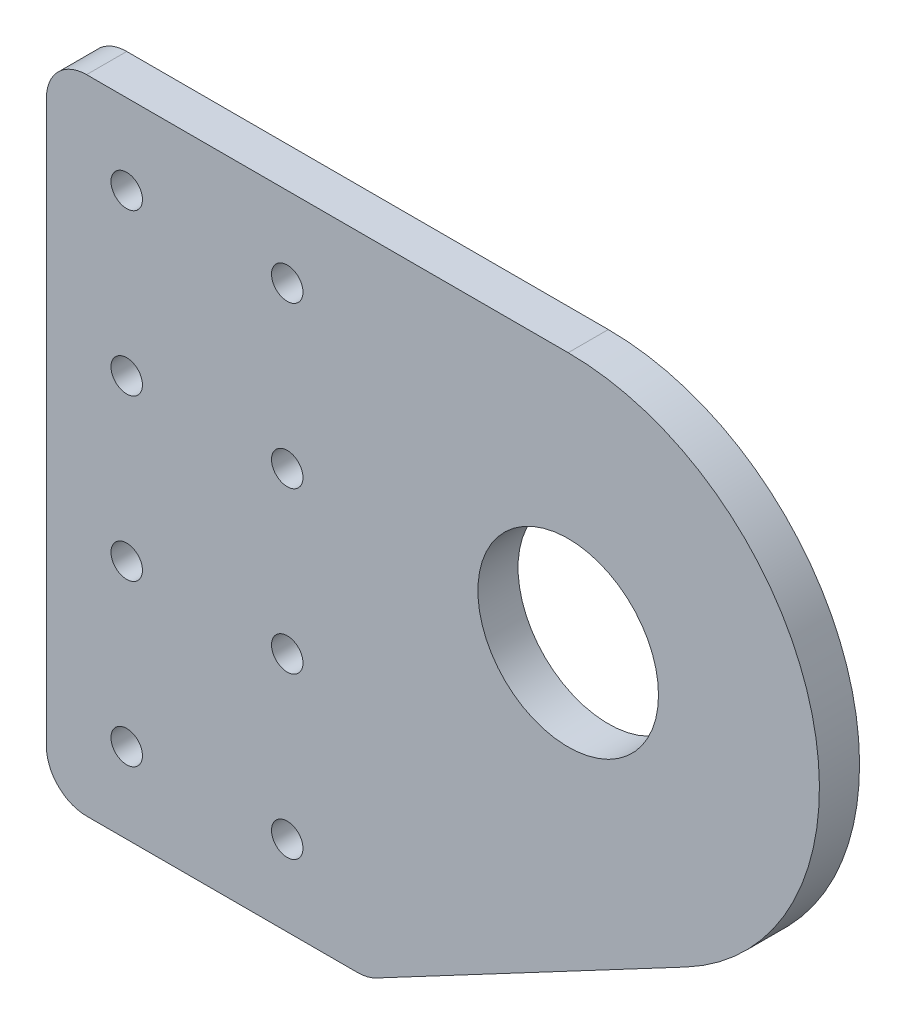
ISO-10303-21;
HEADER;
FILE_DESCRIPTION(('STEP AP214'),'2;1');
FILE_NAME('part.step','',(''),(''),'','','');
FILE_SCHEMA(('AUTOMOTIVE_DESIGN { 1 0 10303 214 1 1 1 1 }'));
ENDSEC;
DATA;
#1=APPLICATION_CONTEXT('core data for automotive mechanical design processes');
#2=APPLICATION_PROTOCOL_DEFINITION('international standard','automotive_design',2000,#1);
#3=PRODUCT_CONTEXT('',#1,'mechanical');
#4=PRODUCT('Part','Part','',(#3));
#5=PRODUCT_RELATED_PRODUCT_CATEGORY('part','',(#4));
#6=PRODUCT_DEFINITION_FORMATION('','',#4);
#7=PRODUCT_DEFINITION_CONTEXT('part definition',#1,'design');
#8=PRODUCT_DEFINITION('design','',#6,#7);
#9=PRODUCT_DEFINITION_SHAPE('','',#8);
#10=(LENGTH_UNIT() NAMED_UNIT(*) SI_UNIT(.MILLI.,.METRE.));
#11=(NAMED_UNIT(*) PLANE_ANGLE_UNIT() SI_UNIT($,.RADIAN.));
#12=(NAMED_UNIT(*) SI_UNIT($,.STERADIAN.) SOLID_ANGLE_UNIT());
#13=UNCERTAINTY_MEASURE_WITH_UNIT(LENGTH_MEASURE(1.E-05),#10,'distance_accuracy_value','');
#14=(GEOMETRIC_REPRESENTATION_CONTEXT(3) GLOBAL_UNCERTAINTY_ASSIGNED_CONTEXT((#13)) GLOBAL_UNIT_ASSIGNED_CONTEXT((#10,
#11,#12)) REPRESENTATION_CONTEXT('',''));
#15=CARTESIAN_POINT('',(0.,0.,0.));
#16=DIRECTION('',(0.,0.,1.));
#17=DIRECTION('',(1.,0.,0.));
#18=AXIS2_PLACEMENT_3D('',#15,#16,#17);
#19=CARTESIAN_POINT('',(482.6,471.551,6.35));
#20=DIRECTION('',(1.,0.,0.));
#21=DIRECTION('',(0.,0.,-1.));
#22=AXIS2_PLACEMENT_3D('',#19,#20,#21);
#23=PLANE('',#22);
#24=DIRECTION('',(0.,-1.,0.));
#25=VECTOR('',#24,1.);
#26=CARTESIAN_POINT('',(482.6,471.551,0.));
#27=LINE('',#26,#25);
#28=CARTESIAN_POINT('',(482.6,465.201,0.));
#29=VERTEX_POINT('',#28);
#30=CARTESIAN_POINT('',(482.6,376.301,0.));
#31=VERTEX_POINT('',#30);
#32=EDGE_CURVE('E138',#29,#31,#27,.T.);
#33=ORIENTED_EDGE('',*,*,#32,.T.);
#34=DIRECTION('',(0.,0.,-1.));
#35=VECTOR('',#34,1.);
#36=CARTESIAN_POINT('',(482.6,376.301,6.35));
#37=LINE('',#36,#35);
#38=CARTESIAN_POINT('',(482.6,376.301,6.35));
#39=VERTEX_POINT('',#38);
#40=EDGE_CURVE('E49',#31,#39,#37,.F.);
#41=ORIENTED_EDGE('',*,*,#40,.T.);
#42=DIRECTION('',(0.,-1.,0.));
#43=VECTOR('',#42,1.);
#44=CARTESIAN_POINT('',(482.6,471.551,6.35));
#45=LINE('',#44,#43);
#46=CARTESIAN_POINT('',(482.6,465.201,6.35));
#47=VERTEX_POINT('',#46);
#48=EDGE_CURVE('E149',#47,#39,#45,.T.);
#49=ORIENTED_EDGE('',*,*,#48,.F.);
#50=DIRECTION('',(0.,0.,-1.));
#51=VECTOR('',#50,1.);
#52=CARTESIAN_POINT('',(482.6,465.201,0.));
#53=LINE('',#52,#51);
#54=EDGE_CURVE('E168',#47,#29,#53,.T.);
#55=ORIENTED_EDGE('',*,*,#54,.T.);
#56=EDGE_LOOP('',(#33,#41,#49,#55));
#57=FACE_BOUND('',#56,.T.);
#58=ADVANCED_FACE('F41',(#57),#23,.F.);
#59=CARTESIAN_POINT('',(482.6,369.951,6.35));
#60=DIRECTION('',(0.,1.,0.));
#61=DIRECTION('',(0.,0.,1.));
#62=AXIS2_PLACEMENT_3D('',#59,#60,#61);
#63=PLANE('',#62);
#64=DIRECTION('',(1.,0.,0.));
#65=VECTOR('',#64,1.);
#66=CARTESIAN_POINT('',(482.6,369.951,0.));
#67=LINE('',#66,#65);
#68=CARTESIAN_POINT('',(488.95,369.951,0.));
#69=VERTEX_POINT('',#68);
#70=CARTESIAN_POINT('',(531.819562537797,369.951,0.));
#71=VERTEX_POINT('',#70);
#72=EDGE_CURVE('E140',#69,#71,#67,.T.);
#73=ORIENTED_EDGE('',*,*,#72,.T.);
#74=DIRECTION('',(0.,0.,-1.));
#75=VECTOR('',#74,1.);
#76=CARTESIAN_POINT('',(531.819562537797,369.951,6.35));
#77=LINE('',#76,#75);
#78=CARTESIAN_POINT('',(531.819562537797,369.951,6.35));
#79=VERTEX_POINT('',#78);
#80=EDGE_CURVE('E161',#71,#79,#77,.F.);
#81=ORIENTED_EDGE('',*,*,#80,.T.);
#82=DIRECTION('',(1.,0.,0.));
#83=VECTOR('',#82,1.);
#84=CARTESIAN_POINT('',(482.6,369.951,6.35));
#85=LINE('',#84,#83);
#86=CARTESIAN_POINT('',(488.95,369.951,6.35));
#87=VERTEX_POINT('',#86);
#88=EDGE_CURVE('E117',#87,#79,#85,.T.);
#89=ORIENTED_EDGE('',*,*,#88,.F.);
#90=DIRECTION('',(0.,0.,-1.));
#91=VECTOR('',#90,1.);
#92=CARTESIAN_POINT('',(488.95,369.951,6.35));
#93=LINE('',#92,#91);
#94=EDGE_CURVE('E158',#87,#69,#93,.T.);
#95=ORIENTED_EDGE('',*,*,#94,.T.);
#96=EDGE_LOOP('',(#73,#81,#89,#95));
#97=FACE_BOUND('',#96,.T.);
#98=ADVANCED_FACE('F183',(#97),#63,.F.);
#99=CARTESIAN_POINT('',(533.4,369.951,6.35));
#100=DIRECTION('',(-0.468739451596558,0.883336474123512,0.));
#101=DIRECTION('',(-0.883336474123512,-0.468739451596558,0.));
#102=AXIS2_PLACEMENT_3D('',#99,#100,#101);
#103=PLANE('',#102);
#104=DIRECTION('',(0.883336474123512,0.468739451596558,0.));
#105=VECTOR('',#104,1.);
#106=CARTESIAN_POINT('',(533.4,369.951,6.35));
#107=LINE('',#106,#105);
#108=CARTESIAN_POINT('',(534.796058055435,370.691813389316,6.35));
#109=VERTEX_POINT('',#108);
#110=CARTESIAN_POINT('',(583.782861940384,396.686491817242,6.35));
#111=VERTEX_POINT('',#110);
#112=EDGE_CURVE('E106',#109,#111,#107,.T.);
#113=ORIENTED_EDGE('',*,*,#112,.F.);
#114=DIRECTION('',(0.,0.,-1.));
#115=VECTOR('',#114,1.);
#116=CARTESIAN_POINT('',(534.796058055435,370.691813389316,6.35));
#117=LINE('',#116,#115);
#118=CARTESIAN_POINT('',(534.796058055435,370.691813389316,0.));
#119=VERTEX_POINT('',#118);
#120=EDGE_CURVE('E127',#109,#119,#117,.T.);
#121=ORIENTED_EDGE('',*,*,#120,.T.);
#122=DIRECTION('',(0.883336474123512,0.468739451596558,0.));
#123=VECTOR('',#122,1.);
#124=CARTESIAN_POINT('',(533.4,369.951,0.));
#125=LINE('',#124,#123);
#126=CARTESIAN_POINT('',(583.782861940384,396.686491817242,0.));
#127=VERTEX_POINT('',#126);
#128=EDGE_CURVE('E123',#119,#127,#125,.T.);
#129=ORIENTED_EDGE('',*,*,#128,.T.);
#130=DIRECTION('',(0.,0.,-1.));
#131=VECTOR('',#130,1.);
#132=CARTESIAN_POINT('',(583.782861940384,396.686491817242,6.35));
#133=LINE('',#132,#131);
#134=EDGE_CURVE('E120',#111,#127,#133,.T.);
#135=ORIENTED_EDGE('',*,*,#134,.F.);
#136=EDGE_LOOP('',(#113,#121,#129,#135));
#137=FACE_BOUND('',#136,.T.);
#138=ADVANCED_FACE('F121',(#137),#103,.F.);
#139=CARTESIAN_POINT('',(565.15,431.800000000067,6.35));
#140=DIRECTION('',(0.,0.,-1.));
#141=DIRECTION('',(-1.,0.,0.));
#142=AXIS2_PLACEMENT_3D('',#139,#140,#141);
#143=CYLINDRICAL_SURFACE('',#142,39.7509999999333);
#144=CARTESIAN_POINT('',(565.15,431.800000000067,0.));
#145=DIRECTION('',(0.,0.,-1.));
#146=DIRECTION('',(-1.,0.,0.));
#147=AXIS2_PLACEMENT_3D('',#144,#145,#146);
#148=CIRCLE('',#147,39.7509999999333);
#149=CARTESIAN_POINT('',(565.15,471.551,0.));
#150=VERTEX_POINT('',#149);
#151=EDGE_CURVE('E145',#150,#127,#148,.T.);
#152=ORIENTED_EDGE('',*,*,#151,.F.);
#153=DIRECTION('',(0.,0.,-1.));
#154=VECTOR('',#153,1.);
#155=CARTESIAN_POINT('',(565.15,471.551,6.35));
#156=LINE('',#155,#154);
#157=CARTESIAN_POINT('',(565.15,471.551,6.35));
#158=VERTEX_POINT('',#157);
#159=EDGE_CURVE('E128',#158,#150,#156,.T.);
#160=ORIENTED_EDGE('',*,*,#159,.F.);
#161=CARTESIAN_POINT('',(565.15,431.800000000067,6.35));
#162=DIRECTION('',(0.,0.,-1.));
#163=DIRECTION('',(-1.,0.,0.));
#164=AXIS2_PLACEMENT_3D('',#161,#162,#163);
#165=CIRCLE('',#164,39.7509999999333);
#166=EDGE_CURVE('E111',#158,#111,#165,.T.);
#167=ORIENTED_EDGE('',*,*,#166,.T.);
#168=ORIENTED_EDGE('',*,*,#134,.T.);
#169=EDGE_LOOP('',(#152,#160,#167,#168));
#170=FACE_BOUND('',#169,.T.);
#171=ADVANCED_FACE('F131',(#170),#143,.T.);
#172=CARTESIAN_POINT('',(482.6,471.551,6.35));
#173=DIRECTION('',(0.,1.,0.));
#174=DIRECTION('',(0.,0.,1.));
#175=AXIS2_PLACEMENT_3D('',#172,#173,#174);
#176=PLANE('',#175);
#177=DIRECTION('',(1.,0.,0.));
#178=VECTOR('',#177,1.);
#179=CARTESIAN_POINT('',(482.6,471.551,0.));
#180=LINE('',#179,#178);
#181=CARTESIAN_POINT('',(488.95,471.551,0.));
#182=VERTEX_POINT('',#181);
#183=EDGE_CURVE('E147',#182,#150,#180,.T.);
#184=ORIENTED_EDGE('',*,*,#183,.F.);
#185=DIRECTION('',(0.,0.,-1.));
#186=VECTOR('',#185,1.);
#187=CARTESIAN_POINT('',(488.95,471.551,6.35));
#188=LINE('',#187,#186);
#189=CARTESIAN_POINT('',(488.95,471.551,6.35));
#190=VERTEX_POINT('',#189);
#191=EDGE_CURVE('E11',#182,#190,#188,.F.);
#192=ORIENTED_EDGE('',*,*,#191,.T.);
#193=DIRECTION('',(1.,0.,0.));
#194=VECTOR('',#193,1.);
#195=CARTESIAN_POINT('',(482.6,471.551,6.35));
#196=LINE('',#195,#194);
#197=EDGE_CURVE('E133',#190,#158,#196,.T.);
#198=ORIENTED_EDGE('',*,*,#197,.T.);
#199=ORIENTED_EDGE('',*,*,#159,.T.);
#200=EDGE_LOOP('',(#184,#192,#198,#199));
#201=FACE_BOUND('',#200,.T.);
#202=ADVANCED_FACE('F277',(#201),#176,.T.);
#203=CARTESIAN_POINT('',(565.15,431.800000000067,6.35));
#204=DIRECTION('',(0.,0.,-1.));
#205=DIRECTION('',(-1.,0.,0.));
#206=AXIS2_PLACEMENT_3D('',#203,#204,#205);
#207=PLANE('',#206);
#208=CARTESIAN_POINT('',(520.7,458.851,6.35));
#209=DIRECTION('',(0.,0.,1.));
#210=DIRECTION('',(1.,0.,0.));
#211=AXIS2_PLACEMENT_3D('',#208,#209,#210);
#212=CIRCLE('',#211,2.48919999999995);
#213=CARTESIAN_POINT('',(523.1892,458.851,6.35));
#214=VERTEX_POINT('',#213);
#215=EDGE_CURVE('E212',#214,#214,#212,.T.);
#216=ORIENTED_EDGE('',*,*,#215,.F.);
#217=EDGE_LOOP('',(#216));
#218=FACE_BOUND('',#217,.T.);
#219=CARTESIAN_POINT('',(520.7,433.451,6.35));
#220=DIRECTION('',(0.,0.,1.));
#221=DIRECTION('',(1.,0.,0.));
#222=AXIS2_PLACEMENT_3D('',#219,#220,#221);
#223=CIRCLE('',#222,2.48919999999995);
#224=CARTESIAN_POINT('',(523.1892,433.451,6.35));
#225=VERTEX_POINT('',#224);
#226=EDGE_CURVE('E206',#225,#225,#223,.T.);
#227=ORIENTED_EDGE('',*,*,#226,.F.);
#228=EDGE_LOOP('',(#227));
#229=FACE_BOUND('',#228,.T.);
#230=CARTESIAN_POINT('',(495.3,433.451,6.35));
#231=DIRECTION('',(0.,0.,1.));
#232=DIRECTION('',(1.,0.,0.));
#233=AXIS2_PLACEMENT_3D('',#230,#231,#232);
#234=CIRCLE('',#233,2.48919999999995);
#235=CARTESIAN_POINT('',(497.7892,433.451,6.35));
#236=VERTEX_POINT('',#235);
#237=EDGE_CURVE('E200',#236,#236,#234,.T.);
#238=ORIENTED_EDGE('',*,*,#237,.F.);
#239=EDGE_LOOP('',(#238));
#240=FACE_BOUND('',#239,.T.);
#241=CARTESIAN_POINT('',(495.3,408.051,6.35));
#242=DIRECTION('',(0.,0.,1.));
#243=DIRECTION('',(1.,0.,0.));
#244=AXIS2_PLACEMENT_3D('',#241,#242,#243);
#245=CIRCLE('',#244,2.48919999999995);
#246=CARTESIAN_POINT('',(497.7892,408.051,6.35));
#247=VERTEX_POINT('',#246);
#248=EDGE_CURVE('E193',#247,#247,#245,.T.);
#249=ORIENTED_EDGE('',*,*,#248,.F.);
#250=EDGE_LOOP('',(#249));
#251=FACE_BOUND('',#250,.T.);
#252=CARTESIAN_POINT('',(565.15,431.800000000067,6.35));
#253=DIRECTION('',(0.,0.,1.));
#254=DIRECTION('',(1.,0.,0.));
#255=AXIS2_PLACEMENT_3D('',#252,#253,#254);
#256=CIRCLE('',#255,14.2875000000003);
#257=CARTESIAN_POINT('',(579.4375,431.800000000067,6.35));
#258=VERTEX_POINT('',#257);
#259=EDGE_CURVE('E229',#258,#258,#256,.T.);
#260=ORIENTED_EDGE('',*,*,#259,.F.);
#261=EDGE_LOOP('',(#260));
#262=FACE_BOUND('',#261,.T.);
#263=CARTESIAN_POINT('',(520.7,382.651,6.35));
#264=DIRECTION('',(0.,0.,1.));
#265=DIRECTION('',(1.,0.,0.));
#266=AXIS2_PLACEMENT_3D('',#263,#264,#265);
#267=CIRCLE('',#266,2.48919999999983);
#268=CARTESIAN_POINT('',(523.1892,382.651,6.35));
#269=VERTEX_POINT('',#268);
#270=EDGE_CURVE('E235',#269,#269,#267,.T.);
#271=ORIENTED_EDGE('',*,*,#270,.F.);
#272=EDGE_LOOP('',(#271));
#273=FACE_BOUND('',#272,.T.);
#274=CARTESIAN_POINT('',(495.3,382.651,6.35));
#275=DIRECTION('',(0.,0.,1.));
#276=DIRECTION('',(1.,0.,0.));
#277=AXIS2_PLACEMENT_3D('',#274,#275,#276);
#278=CIRCLE('',#277,2.48919999999983);
#279=CARTESIAN_POINT('',(497.7892,382.651,6.35));
#280=VERTEX_POINT('',#279);
#281=EDGE_CURVE('E217',#280,#280,#278,.T.);
#282=ORIENTED_EDGE('',*,*,#281,.F.);
#283=EDGE_LOOP('',(#282));
#284=FACE_BOUND('',#283,.T.);
#285=CARTESIAN_POINT('',(520.7,408.051,6.35));
#286=DIRECTION('',(0.,0.,1.));
#287=DIRECTION('',(1.,0.,0.));
#288=AXIS2_PLACEMENT_3D('',#285,#286,#287);
#289=CIRCLE('',#288,2.48919999999983);
#290=CARTESIAN_POINT('',(523.1892,408.051,6.35));
#291=VERTEX_POINT('',#290);
#292=EDGE_CURVE('E224',#291,#291,#289,.T.);
#293=ORIENTED_EDGE('',*,*,#292,.F.);
#294=EDGE_LOOP('',(#293));
#295=FACE_BOUND('',#294,.T.);
#296=CARTESIAN_POINT('',(495.3,458.851,6.35));
#297=DIRECTION('',(0.,0.,1.));
#298=DIRECTION('',(1.,0.,0.));
#299=AXIS2_PLACEMENT_3D('',#296,#297,#298);
#300=CIRCLE('',#299,2.48920000000001);
#301=CARTESIAN_POINT('',(497.7892,458.851,6.35));
#302=VERTEX_POINT('',#301);
#303=EDGE_CURVE('E141',#302,#302,#300,.T.);
#304=ORIENTED_EDGE('',*,*,#303,.F.);
#305=EDGE_LOOP('',(#304));
#306=FACE_BOUND('',#305,.T.);
#307=ORIENTED_EDGE('',*,*,#88,.T.);
#308=CARTESIAN_POINT('',(531.819562537797,376.301,6.35));
#309=DIRECTION('',(0.,0.,-1.));
#310=DIRECTION('',(-1.,0.,0.));
#311=AXIS2_PLACEMENT_3D('',#308,#309,#310);
#312=CIRCLE('',#311,6.35);
#313=EDGE_CURVE('E113',#79,#109,#312,.F.);
#314=ORIENTED_EDGE('',*,*,#313,.T.);
#315=ORIENTED_EDGE('',*,*,#112,.T.);
#316=ORIENTED_EDGE('',*,*,#166,.F.);
#317=ORIENTED_EDGE('',*,*,#197,.F.);
#318=CARTESIAN_POINT('',(488.95,465.201,6.35));
#319=DIRECTION('',(0.,0.,-1.));
#320=DIRECTION('',(-1.,0.,0.));
#321=AXIS2_PLACEMENT_3D('',#318,#319,#320);
#322=CIRCLE('',#321,6.35);
#323=EDGE_CURVE('E163',#190,#47,#322,.F.);
#324=ORIENTED_EDGE('',*,*,#323,.T.);
#325=ORIENTED_EDGE('',*,*,#48,.T.);
#326=CARTESIAN_POINT('',(488.95,376.301,6.35));
#327=DIRECTION('',(0.,0.,-1.));
#328=DIRECTION('',(-1.,0.,0.));
#329=AXIS2_PLACEMENT_3D('',#326,#327,#328);
#330=CIRCLE('',#329,6.35);
#331=EDGE_CURVE('E165',#39,#87,#330,.F.);
#332=ORIENTED_EDGE('',*,*,#331,.T.);
#333=EDGE_LOOP('',(#307,#314,#315,#316,#317,#324,#325,#332));
#334=FACE_BOUND('',#333,.T.);
#335=ADVANCED_FACE('F109',(#218,#229,#240,#251,#262,#273,#284,#295,#306,#334),#207,.F.);
#336=CARTESIAN_POINT('',(565.15,431.800000000067,0.));
#337=DIRECTION('',(0.,0.,-1.));
#338=DIRECTION('',(-1.,0.,0.));
#339=AXIS2_PLACEMENT_3D('',#336,#337,#338);
#340=PLANE('',#339);
#341=CARTESIAN_POINT('',(520.7,458.851,0.));
#342=DIRECTION('',(0.,0.,1.));
#343=DIRECTION('',(1.,0.,0.));
#344=AXIS2_PLACEMENT_3D('',#341,#342,#343);
#345=CIRCLE('',#344,2.48919999999995);
#346=CARTESIAN_POINT('',(523.1892,458.851,0.));
#347=VERTEX_POINT('',#346);
#348=EDGE_CURVE('E190',#347,#347,#345,.T.);
#349=ORIENTED_EDGE('',*,*,#348,.T.);
#350=EDGE_LOOP('',(#349));
#351=FACE_BOUND('',#350,.T.);
#352=CARTESIAN_POINT('',(520.7,433.451,0.));
#353=DIRECTION('',(0.,0.,1.));
#354=DIRECTION('',(1.,0.,0.));
#355=AXIS2_PLACEMENT_3D('',#352,#353,#354);
#356=CIRCLE('',#355,2.48919999999995);
#357=CARTESIAN_POINT('',(523.1892,433.451,0.));
#358=VERTEX_POINT('',#357);
#359=EDGE_CURVE('E209',#358,#358,#356,.T.);
#360=ORIENTED_EDGE('',*,*,#359,.T.);
#361=EDGE_LOOP('',(#360));
#362=FACE_BOUND('',#361,.T.);
#363=CARTESIAN_POINT('',(495.3,433.451,0.));
#364=DIRECTION('',(0.,0.,1.));
#365=DIRECTION('',(1.,0.,0.));
#366=AXIS2_PLACEMENT_3D('',#363,#364,#365);
#367=CIRCLE('',#366,2.48919999999995);
#368=CARTESIAN_POINT('',(497.7892,433.451,0.));
#369=VERTEX_POINT('',#368);
#370=EDGE_CURVE('E203',#369,#369,#367,.T.);
#371=ORIENTED_EDGE('',*,*,#370,.T.);
#372=EDGE_LOOP('',(#371));
#373=FACE_BOUND('',#372,.T.);
#374=CARTESIAN_POINT('',(495.3,408.051,0.));
#375=DIRECTION('',(0.,0.,1.));
#376=DIRECTION('',(1.,0.,0.));
#377=AXIS2_PLACEMENT_3D('',#374,#375,#376);
#378=CIRCLE('',#377,2.48919999999995);
#379=CARTESIAN_POINT('',(497.7892,408.051,0.));
#380=VERTEX_POINT('',#379);
#381=EDGE_CURVE('E196',#380,#380,#378,.T.);
#382=ORIENTED_EDGE('',*,*,#381,.T.);
#383=EDGE_LOOP('',(#382));
#384=FACE_BOUND('',#383,.T.);
#385=CARTESIAN_POINT('',(565.15,431.800000000067,0.));
#386=DIRECTION('',(0.,0.,1.));
#387=DIRECTION('',(1.,0.,0.));
#388=AXIS2_PLACEMENT_3D('',#385,#386,#387);
#389=CIRCLE('',#388,14.2875000000003);
#390=CARTESIAN_POINT('',(579.4375,431.800000000067,0.));
#391=VERTEX_POINT('',#390);
#392=EDGE_CURVE('E232',#391,#391,#389,.T.);
#393=ORIENTED_EDGE('',*,*,#392,.T.);
#394=EDGE_LOOP('',(#393));
#395=FACE_BOUND('',#394,.T.);
#396=CARTESIAN_POINT('',(520.7,382.651,0.));
#397=DIRECTION('',(0.,0.,1.));
#398=DIRECTION('',(1.,0.,0.));
#399=AXIS2_PLACEMENT_3D('',#396,#397,#398);
#400=CIRCLE('',#399,2.48919999999983);
#401=CARTESIAN_POINT('',(523.1892,382.651,0.));
#402=VERTEX_POINT('',#401);
#403=EDGE_CURVE('E221',#402,#402,#400,.T.);
#404=ORIENTED_EDGE('',*,*,#403,.T.);
#405=EDGE_LOOP('',(#404));
#406=FACE_BOUND('',#405,.T.);
#407=CARTESIAN_POINT('',(495.3,382.651,0.));
#408=DIRECTION('',(0.,0.,1.));
#409=DIRECTION('',(1.,0.,0.));
#410=AXIS2_PLACEMENT_3D('',#407,#408,#409);
#411=CIRCLE('',#410,2.48919999999983);
#412=CARTESIAN_POINT('',(497.7892,382.651,0.));
#413=VERTEX_POINT('',#412);
#414=EDGE_CURVE('E220',#413,#413,#411,.T.);
#415=ORIENTED_EDGE('',*,*,#414,.T.);
#416=EDGE_LOOP('',(#415));
#417=FACE_BOUND('',#416,.T.);
#418=CARTESIAN_POINT('',(520.7,408.051,0.));
#419=DIRECTION('',(0.,0.,1.));
#420=DIRECTION('',(1.,0.,0.));
#421=AXIS2_PLACEMENT_3D('',#418,#419,#420);
#422=CIRCLE('',#421,2.48919999999983);
#423=CARTESIAN_POINT('',(523.1892,408.051,0.));
#424=VERTEX_POINT('',#423);
#425=EDGE_CURVE('E197',#424,#424,#422,.T.);
#426=ORIENTED_EDGE('',*,*,#425,.T.);
#427=EDGE_LOOP('',(#426));
#428=FACE_BOUND('',#427,.T.);
#429=CARTESIAN_POINT('',(495.3,458.851,0.));
#430=DIRECTION('',(0.,0.,1.));
#431=DIRECTION('',(1.,0.,0.));
#432=AXIS2_PLACEMENT_3D('',#429,#430,#431);
#433=CIRCLE('',#432,2.48920000000001);
#434=CARTESIAN_POINT('',(497.7892,458.851,0.));
#435=VERTEX_POINT('',#434);
#436=EDGE_CURVE('E187',#435,#435,#433,.T.);
#437=ORIENTED_EDGE('',*,*,#436,.T.);
#438=EDGE_LOOP('',(#437));
#439=FACE_BOUND('',#438,.T.);
#440=ORIENTED_EDGE('',*,*,#128,.F.);
#441=CARTESIAN_POINT('',(531.819562537797,376.301,0.));
#442=DIRECTION('',(0.,0.,-1.));
#443=DIRECTION('',(-1.,0.,0.));
#444=AXIS2_PLACEMENT_3D('',#441,#442,#443);
#445=CIRCLE('',#444,6.35);
#446=EDGE_CURVE('E156',#119,#71,#445,.T.);
#447=ORIENTED_EDGE('',*,*,#446,.T.);
#448=ORIENTED_EDGE('',*,*,#72,.F.);
#449=CARTESIAN_POINT('',(488.95,376.301,0.));
#450=DIRECTION('',(0.,0.,-1.));
#451=DIRECTION('',(-1.,0.,0.));
#452=AXIS2_PLACEMENT_3D('',#449,#450,#451);
#453=CIRCLE('',#452,6.35);
#454=EDGE_CURVE('E154',#69,#31,#453,.T.);
#455=ORIENTED_EDGE('',*,*,#454,.T.);
#456=ORIENTED_EDGE('',*,*,#32,.F.);
#457=CARTESIAN_POINT('',(488.95,465.201,0.));
#458=DIRECTION('',(0.,0.,-1.));
#459=DIRECTION('',(-1.,0.,0.));
#460=AXIS2_PLACEMENT_3D('',#457,#458,#459);
#461=CIRCLE('',#460,6.35);
#462=EDGE_CURVE('E152',#29,#182,#461,.T.);
#463=ORIENTED_EDGE('',*,*,#462,.T.);
#464=ORIENTED_EDGE('',*,*,#183,.T.);
#465=ORIENTED_EDGE('',*,*,#151,.T.);
#466=EDGE_LOOP('',(#440,#447,#448,#455,#456,#463,#464,#465));
#467=FACE_BOUND('',#466,.T.);
#468=ADVANCED_FACE('F175',(#351,#362,#373,#384,#395,#406,#417,#428,#439,#467),#340,.T.);
#469=CARTESIAN_POINT('',(495.3,458.851,6.35));
#470=DIRECTION('',(0.,0.,-1.));
#471=DIRECTION('',(-1.,0.,0.));
#472=AXIS2_PLACEMENT_3D('',#469,#470,#471);
#473=CYLINDRICAL_SURFACE('',#472,2.48920000000001);
#474=ORIENTED_EDGE('',*,*,#303,.T.);
#475=EDGE_LOOP('',(#474));
#476=FACE_BOUND('',#475,.T.);
#477=ORIENTED_EDGE('',*,*,#436,.F.);
#478=EDGE_LOOP('',(#477));
#479=FACE_BOUND('',#478,.T.);
#480=ADVANCED_FACE('F304',(#476,#479),#473,.F.);
#481=CARTESIAN_POINT('',(520.7,408.051,6.35));
#482=DIRECTION('',(0.,0.,-1.));
#483=DIRECTION('',(-1.,0.,0.));
#484=AXIS2_PLACEMENT_3D('',#481,#482,#483);
#485=CYLINDRICAL_SURFACE('',#484,2.48919999999983);
#486=ORIENTED_EDGE('',*,*,#292,.T.);
#487=EDGE_LOOP('',(#486));
#488=FACE_BOUND('',#487,.T.);
#489=ORIENTED_EDGE('',*,*,#425,.F.);
#490=EDGE_LOOP('',(#489));
#491=FACE_BOUND('',#490,.T.);
#492=ADVANCED_FACE('F256',(#488,#491),#485,.F.);
#493=CARTESIAN_POINT('',(495.3,382.651,6.35));
#494=DIRECTION('',(0.,0.,-1.));
#495=DIRECTION('',(-1.,0.,0.));
#496=AXIS2_PLACEMENT_3D('',#493,#494,#495);
#497=CYLINDRICAL_SURFACE('',#496,2.48919999999983);
#498=ORIENTED_EDGE('',*,*,#281,.T.);
#499=EDGE_LOOP('',(#498));
#500=FACE_BOUND('',#499,.T.);
#501=ORIENTED_EDGE('',*,*,#414,.F.);
#502=EDGE_LOOP('',(#501));
#503=FACE_BOUND('',#502,.T.);
#504=ADVANCED_FACE('F246',(#500,#503),#497,.F.);
#505=CARTESIAN_POINT('',(520.7,382.651,6.35));
#506=DIRECTION('',(0.,0.,-1.));
#507=DIRECTION('',(-1.,0.,0.));
#508=AXIS2_PLACEMENT_3D('',#505,#506,#507);
#509=CYLINDRICAL_SURFACE('',#508,2.48919999999983);
#510=ORIENTED_EDGE('',*,*,#270,.T.);
#511=EDGE_LOOP('',(#510));
#512=FACE_BOUND('',#511,.T.);
#513=ORIENTED_EDGE('',*,*,#403,.F.);
#514=EDGE_LOOP('',(#513));
#515=FACE_BOUND('',#514,.T.);
#516=ADVANCED_FACE('F243',(#512,#515),#509,.F.);
#517=CARTESIAN_POINT('',(565.15,431.800000000067,6.35));
#518=DIRECTION('',(0.,0.,-1.));
#519=DIRECTION('',(-1.,0.,0.));
#520=AXIS2_PLACEMENT_3D('',#517,#518,#519);
#521=CYLINDRICAL_SURFACE('',#520,14.2875000000003);
#522=ORIENTED_EDGE('',*,*,#259,.T.);
#523=EDGE_LOOP('',(#522));
#524=FACE_BOUND('',#523,.T.);
#525=ORIENTED_EDGE('',*,*,#392,.F.);
#526=EDGE_LOOP('',(#525));
#527=FACE_BOUND('',#526,.T.);
#528=ADVANCED_FACE('F245',(#524,#527),#521,.F.);
#529=CARTESIAN_POINT('',(495.3,408.051,6.35));
#530=DIRECTION('',(0.,0.,-1.));
#531=DIRECTION('',(-1.,0.,0.));
#532=AXIS2_PLACEMENT_3D('',#529,#530,#531);
#533=CYLINDRICAL_SURFACE('',#532,2.48919999999995);
#534=ORIENTED_EDGE('',*,*,#248,.T.);
#535=EDGE_LOOP('',(#534));
#536=FACE_BOUND('',#535,.T.);
#537=ORIENTED_EDGE('',*,*,#381,.F.);
#538=EDGE_LOOP('',(#537));
#539=FACE_BOUND('',#538,.T.);
#540=ADVANCED_FACE('F253',(#536,#539),#533,.F.);
#541=CARTESIAN_POINT('',(495.3,433.451,6.35));
#542=DIRECTION('',(0.,0.,-1.));
#543=DIRECTION('',(-1.,0.,0.));
#544=AXIS2_PLACEMENT_3D('',#541,#542,#543);
#545=CYLINDRICAL_SURFACE('',#544,2.48919999999995);
#546=ORIENTED_EDGE('',*,*,#237,.T.);
#547=EDGE_LOOP('',(#546));
#548=FACE_BOUND('',#547,.T.);
#549=ORIENTED_EDGE('',*,*,#370,.F.);
#550=EDGE_LOOP('',(#549));
#551=FACE_BOUND('',#550,.T.);
#552=ADVANCED_FACE('F350',(#548,#551),#545,.F.);
#553=CARTESIAN_POINT('',(520.7,433.451,6.35));
#554=DIRECTION('',(0.,0.,-1.));
#555=DIRECTION('',(-1.,0.,0.));
#556=AXIS2_PLACEMENT_3D('',#553,#554,#555);
#557=CYLINDRICAL_SURFACE('',#556,2.48919999999995);
#558=ORIENTED_EDGE('',*,*,#226,.T.);
#559=EDGE_LOOP('',(#558));
#560=FACE_BOUND('',#559,.T.);
#561=ORIENTED_EDGE('',*,*,#359,.F.);
#562=EDGE_LOOP('',(#561));
#563=FACE_BOUND('',#562,.T.);
#564=ADVANCED_FACE('F361',(#560,#563),#557,.F.);
#565=CARTESIAN_POINT('',(520.7,458.851,6.35));
#566=DIRECTION('',(0.,0.,-1.));
#567=DIRECTION('',(-1.,0.,0.));
#568=AXIS2_PLACEMENT_3D('',#565,#566,#567);
#569=CYLINDRICAL_SURFACE('',#568,2.48919999999995);
#570=ORIENTED_EDGE('',*,*,#215,.T.);
#571=EDGE_LOOP('',(#570));
#572=FACE_BOUND('',#571,.T.);
#573=ORIENTED_EDGE('',*,*,#348,.F.);
#574=EDGE_LOOP('',(#573));
#575=FACE_BOUND('',#574,.T.);
#576=ADVANCED_FACE('F269',(#572,#575),#569,.F.);
#577=CARTESIAN_POINT('',(531.819562537797,376.301,6.35));
#578=DIRECTION('',(0.,0.,-1.));
#579=DIRECTION('',(-1.,0.,0.));
#580=AXIS2_PLACEMENT_3D('',#577,#578,#579);
#581=CYLINDRICAL_SURFACE('',#580,6.35);
#582=ORIENTED_EDGE('',*,*,#313,.F.);
#583=ORIENTED_EDGE('',*,*,#80,.F.);
#584=ORIENTED_EDGE('',*,*,#446,.F.);
#585=ORIENTED_EDGE('',*,*,#120,.F.);
#586=EDGE_LOOP('',(#582,#583,#584,#585));
#587=FACE_BOUND('',#586,.T.);
#588=ADVANCED_FACE('F267',(#587),#581,.T.);
#589=CARTESIAN_POINT('',(488.95,376.301,6.35));
#590=DIRECTION('',(0.,0.,-1.));
#591=DIRECTION('',(-1.,0.,0.));
#592=AXIS2_PLACEMENT_3D('',#589,#590,#591);
#593=CYLINDRICAL_SURFACE('',#592,6.35);
#594=ORIENTED_EDGE('',*,*,#331,.F.);
#595=ORIENTED_EDGE('',*,*,#40,.F.);
#596=ORIENTED_EDGE('',*,*,#454,.F.);
#597=ORIENTED_EDGE('',*,*,#94,.F.);
#598=EDGE_LOOP('',(#594,#595,#596,#597));
#599=FACE_BOUND('',#598,.T.);
#600=ADVANCED_FACE('F180',(#599),#593,.T.);
#601=CARTESIAN_POINT('',(488.95,465.201,6.35));
#602=DIRECTION('',(0.,0.,1.));
#603=DIRECTION('',(1.,0.,0.));
#604=AXIS2_PLACEMENT_3D('',#601,#602,#603);
#605=CYLINDRICAL_SURFACE('',#604,6.35);
#606=ORIENTED_EDGE('',*,*,#323,.F.);
#607=ORIENTED_EDGE('',*,*,#191,.F.);
#608=ORIENTED_EDGE('',*,*,#462,.F.);
#609=ORIENTED_EDGE('',*,*,#54,.F.);
#610=EDGE_LOOP('',(#606,#607,#608,#609));
#611=FACE_BOUND('',#610,.T.);
#612=ADVANCED_FACE('F43',(#611),#605,.T.);
#613=CLOSED_SHELL('',(#58,#98,#138,#171,#202,#335,#468,#480,#492,#504,#516,#528,#540,#552,#564,
#576,#588,#600,#612));
#614=MANIFOLD_SOLID_BREP('B2',#613);
#615=ADVANCED_BREP_SHAPE_REPRESENTATION('',(#18,#614),#14);
#616=SHAPE_DEFINITION_REPRESENTATION(#9,#615);
ENDSEC;
END-ISO-10303-21;
